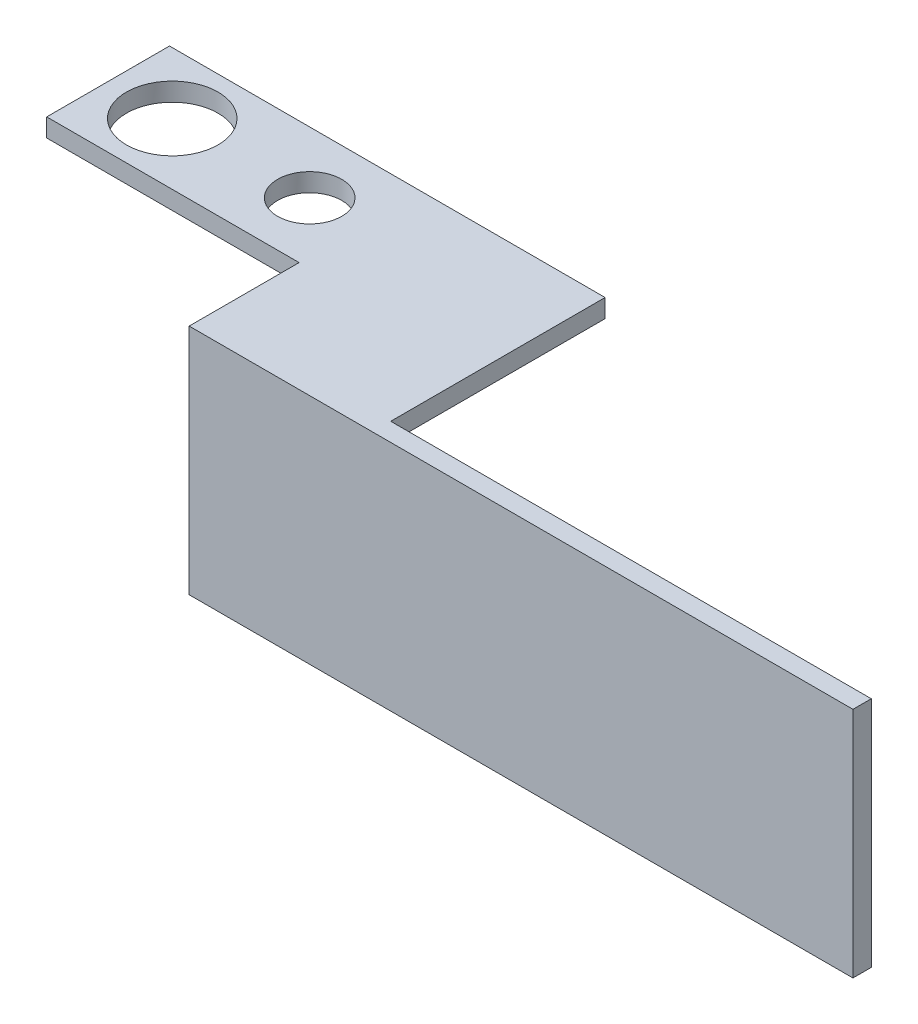
ISO-10303-21;
HEADER;
FILE_DESCRIPTION(('STEP AP214'),'2;1');
FILE_NAME('part.step','',(''),(''),'','','');
FILE_SCHEMA(('AUTOMOTIVE_DESIGN { 1 0 10303 214 1 1 1 1 }'));
ENDSEC;
DATA;
#1=APPLICATION_CONTEXT('core data for automotive mechanical design processes');
#2=APPLICATION_PROTOCOL_DEFINITION('international standard','automotive_design',2000,#1);
#3=PRODUCT_CONTEXT('',#1,'mechanical');
#4=PRODUCT('Part','Part','',(#3));
#5=PRODUCT_RELATED_PRODUCT_CATEGORY('part','',(#4));
#6=PRODUCT_DEFINITION_FORMATION('','',#4);
#7=PRODUCT_DEFINITION_CONTEXT('part definition',#1,'design');
#8=PRODUCT_DEFINITION('design','',#6,#7);
#9=PRODUCT_DEFINITION_SHAPE('','',#8);
#10=(LENGTH_UNIT() NAMED_UNIT(*) SI_UNIT(.MILLI.,.METRE.));
#11=(NAMED_UNIT(*) PLANE_ANGLE_UNIT() SI_UNIT($,.RADIAN.));
#12=(NAMED_UNIT(*) SI_UNIT($,.STERADIAN.) SOLID_ANGLE_UNIT());
#13=UNCERTAINTY_MEASURE_WITH_UNIT(LENGTH_MEASURE(1.E-05),#10,'distance_accuracy_value','');
#14=(GEOMETRIC_REPRESENTATION_CONTEXT(3) GLOBAL_UNCERTAINTY_ASSIGNED_CONTEXT((#13)) GLOBAL_UNIT_ASSIGNED_CONTEXT((#10,
#11,#12)) REPRESENTATION_CONTEXT('',''));
#15=CARTESIAN_POINT('',(0.,0.,0.));
#16=DIRECTION('',(0.,0.,1.));
#17=DIRECTION('',(1.,0.,0.));
#18=AXIS2_PLACEMENT_3D('',#15,#16,#17);
#19=CARTESIAN_POINT('',(100.,0.,-2.));
#20=DIRECTION('',(0.,0.,1.));
#21=DIRECTION('',(1.,0.,0.));
#22=AXIS2_PLACEMENT_3D('',#19,#20,#21);
#23=PLANE('',#22);
#24=DIRECTION('',(-1.,0.,0.));
#25=VECTOR('',#24,1.);
#26=CARTESIAN_POINT('',(100.,2.,-2.));
#27=LINE('',#26,#25);
#28=CARTESIAN_POINT('',(47.547862324127,2.,-1.99999999999999));
#29=VERTEX_POINT('',#28);
#30=CARTESIAN_POINT('',(0.,2.,-2.));
#31=VERTEX_POINT('',#30);
#32=EDGE_CURVE('E44',#29,#31,#27,.T.);
#33=ORIENTED_EDGE('',*,*,#32,.F.);
#34=DIRECTION('',(0.,1.,0.));
#35=VECTOR('',#34,1.);
#36=CARTESIAN_POINT('',(47.547862324127,-57.435065480669,-2.));
#37=LINE('',#36,#35);
#38=CARTESIAN_POINT('',(47.547862324127,0.,-1.99999999999999));
#39=VERTEX_POINT('',#38);
#40=EDGE_CURVE('E195',#39,#29,#37,.T.);
#41=ORIENTED_EDGE('',*,*,#40,.F.);
#42=DIRECTION('',(-1.,0.,0.));
#43=VECTOR('',#42,1.);
#44=CARTESIAN_POINT('',(100.,0.,-2.));
#45=LINE('',#44,#43);
#46=CARTESIAN_POINT('',(0.,0.,-2.));
#47=VERTEX_POINT('',#46);
#48=EDGE_CURVE('E11',#39,#47,#45,.T.);
#49=ORIENTED_EDGE('',*,*,#48,.T.);
#50=DIRECTION('',(0.,1.,0.));
#51=VECTOR('',#50,1.);
#52=CARTESIAN_POINT('',(0.,0.,-2.));
#53=LINE('',#52,#51);
#54=EDGE_CURVE('E160',#47,#31,#53,.T.);
#55=ORIENTED_EDGE('',*,*,#54,.T.);
#56=EDGE_LOOP('',(#33,#41,#49,#55));
#57=FACE_BOUND('',#56,.T.);
#58=ADVANCED_FACE('F37',(#57),#23,.F.);
#59=CARTESIAN_POINT('',(100.,2.,-2.));
#60=DIRECTION('',(0.,-1.,0.));
#61=DIRECTION('',(0.,0.,-1.));
#62=AXIS2_PLACEMENT_3D('',#59,#60,#61);
#63=PLANE('',#62);
#64=CARTESIAN_POINT('',(22.,2.,4.7));
#65=DIRECTION('',(0.,1.,0.));
#66=DIRECTION('',(0.,0.,1.));
#67=AXIS2_PLACEMENT_3D('',#64,#65,#66);
#68=CIRCLE('',#67,3.5);
#69=CARTESIAN_POINT('',(22.,2.,8.2));
#70=VERTEX_POINT('',#69);
#71=EDGE_CURVE('E192',#70,#70,#68,.T.);
#72=ORIENTED_EDGE('',*,*,#71,.F.);
#73=EDGE_LOOP('',(#72));
#74=FACE_BOUND('',#73,.T.);
#75=CARTESIAN_POINT('',(7.,2.,4.7));
#76=DIRECTION('',(0.,1.,0.));
#77=DIRECTION('',(0.,0.,1.));
#78=AXIS2_PLACEMENT_3D('',#75,#76,#77);
#79=CIRCLE('',#78,5.);
#80=CARTESIAN_POINT('',(7.,2.,9.7));
#81=VERTEX_POINT('',#80);
#82=EDGE_CURVE('E178',#81,#81,#79,.T.);
#83=ORIENTED_EDGE('',*,*,#82,.F.);
#84=EDGE_LOOP('',(#83));
#85=FACE_BOUND('',#84,.T.);
#86=DIRECTION('',(1.,0.,0.));
#87=VECTOR('',#86,1.);
#88=CARTESIAN_POINT('',(100.,2.,21.4));
#89=LINE('',#88,#87);
#90=CARTESIAN_POINT('',(47.547862324127,2.,21.4));
#91=VERTEX_POINT('',#90);
#92=CARTESIAN_POINT('',(100.,2.,21.4));
#93=VERTEX_POINT('',#92);
#94=EDGE_CURVE('E185',#91,#93,#89,.T.);
#95=ORIENTED_EDGE('',*,*,#94,.F.);
#96=DIRECTION('',(0.,0.,1.));
#97=VECTOR('',#96,1.);
#98=CARTESIAN_POINT('',(47.547862324127,2.,-1.99999999999999));
#99=LINE('',#98,#97);
#100=EDGE_CURVE('E156',#29,#91,#99,.T.);
#101=ORIENTED_EDGE('',*,*,#100,.F.);
#102=ORIENTED_EDGE('',*,*,#32,.T.);
#103=DIRECTION('',(0.,0.,1.));
#104=VECTOR('',#103,1.);
#105=CARTESIAN_POINT('',(0.,2.,-2.));
#106=LINE('',#105,#104);
#107=CARTESIAN_POINT('',(0.,2.,11.4));
#108=VERTEX_POINT('',#107);
#109=EDGE_CURVE('E154',#31,#108,#106,.T.);
#110=ORIENTED_EDGE('',*,*,#109,.T.);
#111=DIRECTION('',(-1.,0.,0.));
#112=VECTOR('',#111,1.);
#113=CARTESIAN_POINT('',(0.,2.,11.4));
#114=LINE('',#113,#112);
#115=CARTESIAN_POINT('',(27.547862324127,2.,11.4));
#116=VERTEX_POINT('',#115);
#117=EDGE_CURVE('E59',#116,#108,#114,.T.);
#118=ORIENTED_EDGE('',*,*,#117,.F.);
#119=DIRECTION('',(0.,0.,-1.));
#120=VECTOR('',#119,1.);
#121=CARTESIAN_POINT('',(27.547862324127,2.,21.4));
#122=LINE('',#121,#120);
#123=CARTESIAN_POINT('',(27.547862324127,2.,23.4));
#124=VERTEX_POINT('',#123);
#125=EDGE_CURVE('E177',#124,#116,#122,.T.);
#126=ORIENTED_EDGE('',*,*,#125,.F.);
#127=DIRECTION('',(-1.,0.,0.));
#128=VECTOR('',#127,1.);
#129=CARTESIAN_POINT('',(100.,2.,23.4));
#130=LINE('',#129,#128);
#131=CARTESIAN_POINT('',(100.,2.,23.4));
#132=VERTEX_POINT('',#131);
#133=EDGE_CURVE('E144',#132,#124,#130,.T.);
#134=ORIENTED_EDGE('',*,*,#133,.F.);
#135=DIRECTION('',(0.,0.,1.));
#136=VECTOR('',#135,1.);
#137=CARTESIAN_POINT('',(100.,2.,-2.));
#138=LINE('',#137,#136);
#139=EDGE_CURVE('E168',#93,#132,#138,.T.);
#140=ORIENTED_EDGE('',*,*,#139,.F.);
#141=EDGE_LOOP('',(#95,#101,#102,#110,#118,#126,#134,#140));
#142=FACE_BOUND('',#141,.T.);
#143=ADVANCED_FACE('F152',(#74,#85,#142),#63,.F.);
#144=CARTESIAN_POINT('',(100.,2.,23.4));
#145=DIRECTION('',(0.,0.,-1.));
#146=DIRECTION('',(-1.,0.,0.));
#147=AXIS2_PLACEMENT_3D('',#144,#145,#146);
#148=PLANE('',#147);
#149=DIRECTION('',(0.,1.,0.));
#150=VECTOR('',#149,1.);
#151=CARTESIAN_POINT('',(27.547862324127,-57.435065480669,23.4));
#152=LINE('',#151,#150);
#153=CARTESIAN_POINT('',(27.547862324127,-23.4,23.4));
#154=VERTEX_POINT('',#153);
#155=EDGE_CURVE('E126',#154,#124,#152,.T.);
#156=ORIENTED_EDGE('',*,*,#155,.F.);
#157=DIRECTION('',(-1.,0.,0.));
#158=VECTOR('',#157,1.);
#159=CARTESIAN_POINT('',(100.,-23.4,23.4));
#160=LINE('',#159,#158);
#161=CARTESIAN_POINT('',(100.,-23.4,23.4));
#162=VERTEX_POINT('',#161);
#163=EDGE_CURVE('E134',#162,#154,#160,.T.);
#164=ORIENTED_EDGE('',*,*,#163,.F.);
#165=DIRECTION('',(0.,-1.,0.));
#166=VECTOR('',#165,1.);
#167=CARTESIAN_POINT('',(100.,2.,23.4));
#168=LINE('',#167,#166);
#169=EDGE_CURVE('E171',#132,#162,#168,.T.);
#170=ORIENTED_EDGE('',*,*,#169,.F.);
#171=ORIENTED_EDGE('',*,*,#133,.T.);
#172=EDGE_LOOP('',(#156,#164,#170,#171));
#173=FACE_BOUND('',#172,.T.);
#174=ADVANCED_FACE('F210',(#173),#148,.F.);
#175=CARTESIAN_POINT('',(100.,-23.4,23.4));
#176=DIRECTION('',(0.,1.,0.));
#177=DIRECTION('',(0.,0.,1.));
#178=AXIS2_PLACEMENT_3D('',#175,#176,#177);
#179=PLANE('',#178);
#180=ORIENTED_EDGE('',*,*,#163,.T.);
#181=DIRECTION('',(0.,0.,-1.));
#182=VECTOR('',#181,1.);
#183=CARTESIAN_POINT('',(27.547862324127,-23.4,23.401));
#184=LINE('',#183,#182);
#185=CARTESIAN_POINT('',(27.547862324127,-23.4,21.4));
#186=VERTEX_POINT('',#185);
#187=EDGE_CURVE('E116',#154,#186,#184,.T.);
#188=ORIENTED_EDGE('',*,*,#187,.T.);
#189=DIRECTION('',(-1.,0.,0.));
#190=VECTOR('',#189,1.);
#191=CARTESIAN_POINT('',(100.,-23.4,21.4));
#192=LINE('',#191,#190);
#193=CARTESIAN_POINT('',(100.,-23.4,21.4));
#194=VERTEX_POINT('',#193);
#195=EDGE_CURVE('E112',#194,#186,#192,.T.);
#196=ORIENTED_EDGE('',*,*,#195,.F.);
#197=DIRECTION('',(0.,0.,-1.));
#198=VECTOR('',#197,1.);
#199=CARTESIAN_POINT('',(100.,-23.4,23.4));
#200=LINE('',#199,#198);
#201=EDGE_CURVE('E136',#162,#194,#200,.T.);
#202=ORIENTED_EDGE('',*,*,#201,.F.);
#203=EDGE_LOOP('',(#180,#188,#196,#202));
#204=FACE_BOUND('',#203,.T.);
#205=ADVANCED_FACE('F202',(#204),#179,.F.);
#206=CARTESIAN_POINT('',(100.,0.,21.4));
#207=DIRECTION('',(0.,0.,-1.));
#208=DIRECTION('',(-1.,0.,0.));
#209=AXIS2_PLACEMENT_3D('',#206,#207,#208);
#210=PLANE('',#209);
#211=DIRECTION('',(0.,-1.,0.));
#212=VECTOR('',#211,1.);
#213=CARTESIAN_POINT('',(27.547862324127,-23.4,21.4));
#214=LINE('',#213,#212);
#215=CARTESIAN_POINT('',(27.547862324127,0.,21.4));
#216=VERTEX_POINT('',#215);
#217=EDGE_CURVE('E106',#216,#186,#214,.T.);
#218=ORIENTED_EDGE('',*,*,#217,.F.);
#219=DIRECTION('',(-1.,0.,0.));
#220=VECTOR('',#219,1.);
#221=CARTESIAN_POINT('',(100.,0.,21.4));
#222=LINE('',#221,#220);
#223=CARTESIAN_POINT('',(47.547862324127,0.,21.4));
#224=VERTEX_POINT('',#223);
#225=EDGE_CURVE('E110',#224,#216,#222,.T.);
#226=ORIENTED_EDGE('',*,*,#225,.F.);
#227=DIRECTION('',(0.,1.,0.));
#228=VECTOR('',#227,1.);
#229=CARTESIAN_POINT('',(47.547862324127,-57.435065480669,21.4));
#230=LINE('',#229,#228);
#231=EDGE_CURVE('E164',#224,#91,#230,.T.);
#232=ORIENTED_EDGE('',*,*,#231,.T.);
#233=ORIENTED_EDGE('',*,*,#94,.T.);
#234=DIRECTION('',(0.,1.,0.));
#235=VECTOR('',#234,1.);
#236=CARTESIAN_POINT('',(100.,-23.4,21.4));
#237=LINE('',#236,#235);
#238=EDGE_CURVE('E51',#194,#93,#237,.T.);
#239=ORIENTED_EDGE('',*,*,#238,.F.);
#240=ORIENTED_EDGE('',*,*,#195,.T.);
#241=EDGE_LOOP('',(#218,#226,#232,#233,#239,#240));
#242=FACE_BOUND('',#241,.T.);
#243=ADVANCED_FACE('F108',(#242),#210,.T.);
#244=CARTESIAN_POINT('',(100.,0.,0.));
#245=DIRECTION('',(0.,-1.,0.));
#246=DIRECTION('',(0.,0.,-1.));
#247=AXIS2_PLACEMENT_3D('',#244,#245,#246);
#248=PLANE('',#247);
#249=DIRECTION('',(0.,0.,1.));
#250=VECTOR('',#249,1.);
#251=CARTESIAN_POINT('',(47.547862324127,0.,-1.99999999999999));
#252=LINE('',#251,#250);
#253=EDGE_CURVE('E132',#39,#224,#252,.T.);
#254=ORIENTED_EDGE('',*,*,#253,.T.);
#255=ORIENTED_EDGE('',*,*,#225,.T.);
#256=DIRECTION('',(0.,0.,-1.));
#257=VECTOR('',#256,1.);
#258=CARTESIAN_POINT('',(27.547862324127,0.,21.4));
#259=LINE('',#258,#257);
#260=CARTESIAN_POINT('',(27.547862324127,0.,11.4));
#261=VERTEX_POINT('',#260);
#262=EDGE_CURVE('E120',#216,#261,#259,.T.);
#263=ORIENTED_EDGE('',*,*,#262,.T.);
#264=DIRECTION('',(-1.,0.,0.));
#265=VECTOR('',#264,1.);
#266=CARTESIAN_POINT('',(0.,0.,11.4));
#267=LINE('',#266,#265);
#268=CARTESIAN_POINT('',(0.,0.,11.4));
#269=VERTEX_POINT('',#268);
#270=EDGE_CURVE('E184',#261,#269,#267,.T.);
#271=ORIENTED_EDGE('',*,*,#270,.T.);
#272=DIRECTION('',(0.,0.,1.));
#273=VECTOR('',#272,1.);
#274=CARTESIAN_POINT('',(0.,0.,0.));
#275=LINE('',#274,#273);
#276=EDGE_CURVE('E139',#47,#269,#275,.T.);
#277=ORIENTED_EDGE('',*,*,#276,.F.);
#278=ORIENTED_EDGE('',*,*,#48,.F.);
#279=EDGE_LOOP('',(#254,#255,#263,#271,#277,#278));
#280=FACE_BOUND('',#279,.T.);
#281=CARTESIAN_POINT('',(22.,0.,4.7));
#282=DIRECTION('',(0.,-1.,0.));
#283=DIRECTION('',(0.,0.,-1.));
#284=AXIS2_PLACEMENT_3D('',#281,#282,#283);
#285=CIRCLE('',#284,3.5);
#286=CARTESIAN_POINT('',(22.,0.,1.2));
#287=VERTEX_POINT('',#286);
#288=EDGE_CURVE('E181',#287,#287,#285,.F.);
#289=ORIENTED_EDGE('',*,*,#288,.T.);
#290=EDGE_LOOP('',(#289));
#291=FACE_BOUND('',#290,.T.);
#292=CARTESIAN_POINT('',(7.,0.,4.7));
#293=DIRECTION('',(0.,-1.,0.));
#294=DIRECTION('',(0.,0.,-1.));
#295=AXIS2_PLACEMENT_3D('',#292,#293,#294);
#296=CIRCLE('',#295,5.);
#297=CARTESIAN_POINT('',(7.,0.,-0.299999999999998));
#298=VERTEX_POINT('',#297);
#299=EDGE_CURVE('E174',#298,#298,#296,.F.);
#300=ORIENTED_EDGE('',*,*,#299,.T.);
#301=EDGE_LOOP('',(#300));
#302=FACE_BOUND('',#301,.T.);
#303=ADVANCED_FACE('F129',(#280,#291,#302),#248,.T.);
#304=CARTESIAN_POINT('',(100.,0.,0.));
#305=DIRECTION('',(1.,0.,0.));
#306=DIRECTION('',(0.,0.,-1.));
#307=AXIS2_PLACEMENT_3D('',#304,#305,#306);
#308=PLANE('',#307);
#309=ORIENTED_EDGE('',*,*,#238,.T.);
#310=ORIENTED_EDGE('',*,*,#139,.T.);
#311=ORIENTED_EDGE('',*,*,#169,.T.);
#312=ORIENTED_EDGE('',*,*,#201,.T.);
#313=EDGE_LOOP('',(#309,#310,#311,#312));
#314=FACE_BOUND('',#313,.T.);
#315=ADVANCED_FACE('F211',(#314),#308,.T.);
#316=CARTESIAN_POINT('',(0.,0.,0.));
#317=DIRECTION('',(1.,0.,0.));
#318=DIRECTION('',(0.,0.,-1.));
#319=AXIS2_PLACEMENT_3D('',#316,#317,#318);
#320=PLANE('',#319);
#321=ORIENTED_EDGE('',*,*,#276,.T.);
#322=DIRECTION('',(0.,1.,0.));
#323=VECTOR('',#322,1.);
#324=CARTESIAN_POINT('',(0.,-57.435065480669,11.4));
#325=LINE('',#324,#323);
#326=EDGE_CURVE('E167',#269,#108,#325,.T.);
#327=ORIENTED_EDGE('',*,*,#326,.T.);
#328=ORIENTED_EDGE('',*,*,#109,.F.);
#329=ORIENTED_EDGE('',*,*,#54,.F.);
#330=EDGE_LOOP('',(#321,#327,#328,#329));
#331=FACE_BOUND('',#330,.T.);
#332=ADVANCED_FACE('F166',(#331),#320,.F.);
#333=CARTESIAN_POINT('',(27.547862324127,-57.435065480669,21.4));
#334=DIRECTION('',(1.,0.,0.));
#335=DIRECTION('',(0.,0.,-1.));
#336=AXIS2_PLACEMENT_3D('',#333,#334,#335);
#337=PLANE('',#336);
#338=ORIENTED_EDGE('',*,*,#155,.T.);
#339=ORIENTED_EDGE('',*,*,#125,.T.);
#340=DIRECTION('',(0.,1.,0.));
#341=VECTOR('',#340,1.);
#342=CARTESIAN_POINT('',(27.547862324127,-57.435065480669,11.4));
#343=LINE('',#342,#341);
#344=EDGE_CURVE('E123',#261,#116,#343,.T.);
#345=ORIENTED_EDGE('',*,*,#344,.F.);
#346=ORIENTED_EDGE('',*,*,#262,.F.);
#347=ORIENTED_EDGE('',*,*,#217,.T.);
#348=ORIENTED_EDGE('',*,*,#187,.F.);
#349=EDGE_LOOP('',(#338,#339,#345,#346,#347,#348));
#350=FACE_BOUND('',#349,.T.);
#351=ADVANCED_FACE('F121',(#350),#337,.F.);
#352=CARTESIAN_POINT('',(0.,-57.435065480669,11.4));
#353=DIRECTION('',(0.,0.,-1.));
#354=DIRECTION('',(0.,1.,0.));
#355=AXIS2_PLACEMENT_3D('',#352,#353,#354);
#356=PLANE('',#355);
#357=ORIENTED_EDGE('',*,*,#344,.T.);
#358=ORIENTED_EDGE('',*,*,#117,.T.);
#359=ORIENTED_EDGE('',*,*,#326,.F.);
#360=ORIENTED_EDGE('',*,*,#270,.F.);
#361=EDGE_LOOP('',(#357,#358,#359,#360));
#362=FACE_BOUND('',#361,.T.);
#363=ADVANCED_FACE('F214',(#362),#356,.F.);
#364=CARTESIAN_POINT('',(47.547862324127,-57.435065480669,-2.));
#365=DIRECTION('',(-1.,0.,0.));
#366=DIRECTION('',(0.,0.,1.));
#367=AXIS2_PLACEMENT_3D('',#364,#365,#366);
#368=PLANE('',#367);
#369=ORIENTED_EDGE('',*,*,#40,.T.);
#370=ORIENTED_EDGE('',*,*,#100,.T.);
#371=ORIENTED_EDGE('',*,*,#231,.F.);
#372=ORIENTED_EDGE('',*,*,#253,.F.);
#373=EDGE_LOOP('',(#369,#370,#371,#372));
#374=FACE_BOUND('',#373,.T.);
#375=ADVANCED_FACE('F213',(#374),#368,.F.);
#376=CARTESIAN_POINT('',(7.,-57.435065480669,4.7));
#377=DIRECTION('',(0.,1.,0.));
#378=DIRECTION('',(0.,0.,1.));
#379=AXIS2_PLACEMENT_3D('',#376,#377,#378);
#380=CYLINDRICAL_SURFACE('',#379,5.);
#381=ORIENTED_EDGE('',*,*,#82,.T.);
#382=EDGE_LOOP('',(#381));
#383=FACE_BOUND('',#382,.T.);
#384=ORIENTED_EDGE('',*,*,#299,.F.);
#385=EDGE_LOOP('',(#384));
#386=FACE_BOUND('',#385,.T.);
#387=ADVANCED_FACE('F221',(#383,#386),#380,.F.);
#388=CARTESIAN_POINT('',(22.,-57.435065480669,4.7));
#389=DIRECTION('',(0.,1.,0.));
#390=DIRECTION('',(0.,0.,1.));
#391=AXIS2_PLACEMENT_3D('',#388,#389,#390);
#392=CYLINDRICAL_SURFACE('',#391,3.5);
#393=ORIENTED_EDGE('',*,*,#71,.T.);
#394=EDGE_LOOP('',(#393));
#395=FACE_BOUND('',#394,.T.);
#396=ORIENTED_EDGE('',*,*,#288,.F.);
#397=EDGE_LOOP('',(#396));
#398=FACE_BOUND('',#397,.T.);
#399=ADVANCED_FACE('F248',(#395,#398),#392,.F.);
#400=CLOSED_SHELL('',(#58,#143,#174,#205,#243,#303,#315,#332,#351,#363,#375,#387,#399));
#401=MANIFOLD_SOLID_BREP('B2',#400);
#402=ADVANCED_BREP_SHAPE_REPRESENTATION('',(#18,#401),#14);
#403=SHAPE_DEFINITION_REPRESENTATION(#9,#402);
ENDSEC;
END-ISO-10303-21;
